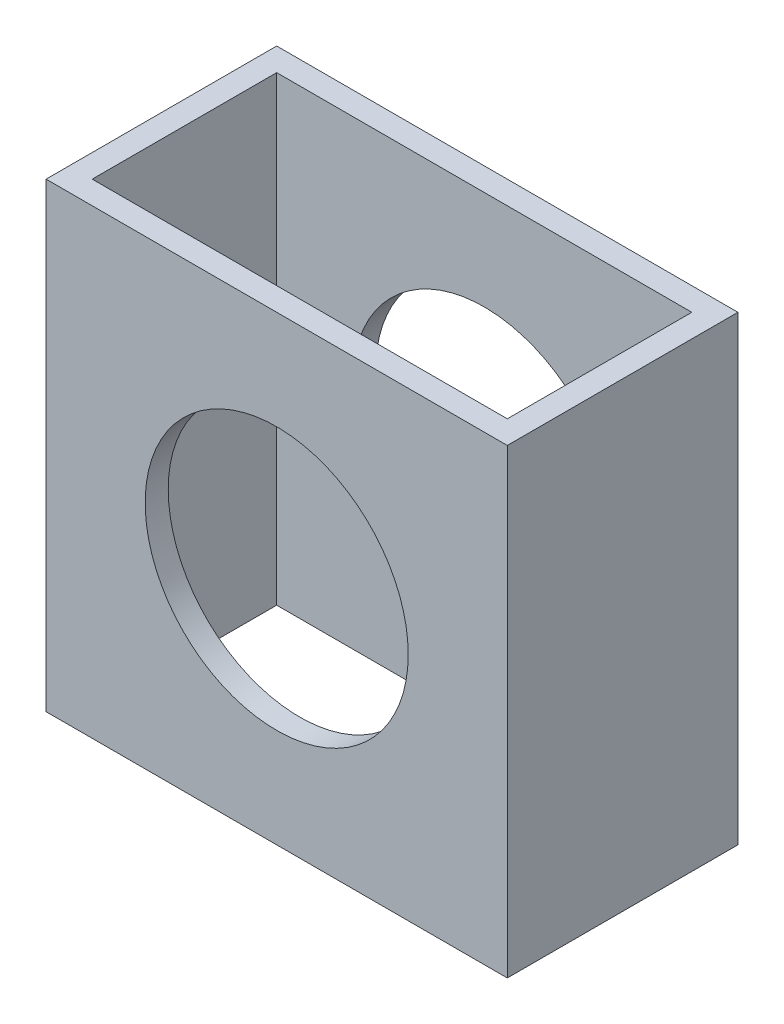
ISO-10303-21;
HEADER;
FILE_DESCRIPTION(('STEP AP214'),'2;1');
FILE_NAME('part.step','',(''),(''),'','','');
FILE_SCHEMA(('AUTOMOTIVE_DESIGN { 1 0 10303 214 1 1 1 1 }'));
ENDSEC;
DATA;
#1=APPLICATION_CONTEXT('core data for automotive mechanical design processes');
#2=APPLICATION_PROTOCOL_DEFINITION('international standard','automotive_design',2000,#1);
#3=PRODUCT_CONTEXT('',#1,'mechanical');
#4=PRODUCT('Part','Part','',(#3));
#5=PRODUCT_RELATED_PRODUCT_CATEGORY('part','',(#4));
#6=PRODUCT_DEFINITION_FORMATION('','',#4);
#7=PRODUCT_DEFINITION_CONTEXT('part definition',#1,'design');
#8=PRODUCT_DEFINITION('design','',#6,#7);
#9=PRODUCT_DEFINITION_SHAPE('','',#8);
#10=(LENGTH_UNIT() NAMED_UNIT(*) SI_UNIT(.MILLI.,.METRE.));
#11=(NAMED_UNIT(*) PLANE_ANGLE_UNIT() SI_UNIT($,.RADIAN.));
#12=(NAMED_UNIT(*) SI_UNIT($,.STERADIAN.) SOLID_ANGLE_UNIT());
#13=UNCERTAINTY_MEASURE_WITH_UNIT(LENGTH_MEASURE(1.E-05),#10,'distance_accuracy_value','');
#14=(GEOMETRIC_REPRESENTATION_CONTEXT(3) GLOBAL_UNCERTAINTY_ASSIGNED_CONTEXT((#13)) GLOBAL_UNIT_ASSIGNED_CONTEXT((#10,
#11,#12)) REPRESENTATION_CONTEXT('',''));
#15=CARTESIAN_POINT('',(0.,0.,0.));
#16=DIRECTION('',(0.,0.,1.));
#17=DIRECTION('',(1.,0.,0.));
#18=AXIS2_PLACEMENT_3D('',#15,#16,#17);
#19=CARTESIAN_POINT('',(-22.86,50.8,-10.16));
#20=DIRECTION('',(0.,0.,1.));
#21=DIRECTION('',(1.,0.,0.));
#22=AXIS2_PLACEMENT_3D('',#19,#20,#21);
#23=PLANE('',#22);
#24=CARTESIAN_POINT('',(0.,25.4,-10.16));
#25=DIRECTION('',(0.,0.,1.));
#26=DIRECTION('',(1.,0.,0.));
#27=AXIS2_PLACEMENT_3D('',#24,#25,#26);
#28=CIRCLE('',#27,14.48562);
#29=CARTESIAN_POINT('',(14.48562,25.4,-10.16));
#30=VERTEX_POINT('',#29);
#31=EDGE_CURVE('E150',#30,#30,#28,.T.);
#32=ORIENTED_EDGE('',*,*,#31,.F.);
#33=EDGE_LOOP('',(#32));
#34=FACE_BOUND('',#33,.T.);
#35=DIRECTION('',(-1.,0.,0.));
#36=VECTOR('',#35,1.);
#37=CARTESIAN_POINT('',(-22.86,0.,-10.16));
#38=LINE('',#37,#36);
#39=CARTESIAN_POINT('',(22.86,0.,-10.16));
#40=VERTEX_POINT('',#39);
#41=CARTESIAN_POINT('',(-22.86,0.,-10.16));
#42=VERTEX_POINT('',#41);
#43=EDGE_CURVE('E156',#40,#42,#38,.T.);
#44=ORIENTED_EDGE('',*,*,#43,.F.);
#45=DIRECTION('',(0.,-1.,0.));
#46=VECTOR('',#45,1.);
#47=CARTESIAN_POINT('',(22.86,50.8,-10.16));
#48=LINE('',#47,#46);
#49=CARTESIAN_POINT('',(22.86,50.8,-10.16));
#50=VERTEX_POINT('',#49);
#51=EDGE_CURVE('E12',#50,#40,#48,.T.);
#52=ORIENTED_EDGE('',*,*,#51,.F.);
#53=DIRECTION('',(-1.,0.,0.));
#54=VECTOR('',#53,1.);
#55=CARTESIAN_POINT('',(-22.86,50.8,-10.16));
#56=LINE('',#55,#54);
#57=CARTESIAN_POINT('',(-22.86,50.8,-10.16));
#58=VERTEX_POINT('',#57);
#59=EDGE_CURVE('E137',#50,#58,#56,.T.);
#60=ORIENTED_EDGE('',*,*,#59,.T.);
#61=DIRECTION('',(0.,-1.,0.));
#62=VECTOR('',#61,1.);
#63=CARTESIAN_POINT('',(-22.86,50.8,-10.16));
#64=LINE('',#63,#62);
#65=EDGE_CURVE('E68',#58,#42,#64,.T.);
#66=ORIENTED_EDGE('',*,*,#65,.T.);
#67=EDGE_LOOP('',(#44,#52,#60,#66));
#68=FACE_BOUND('',#67,.T.);
#69=ADVANCED_FACE('F49',(#34,#68),#23,.T.);
#70=CARTESIAN_POINT('',(22.86,50.8,-10.16));
#71=DIRECTION('',(-1.,0.,0.));
#72=DIRECTION('',(0.,0.,1.));
#73=AXIS2_PLACEMENT_3D('',#70,#71,#72);
#74=PLANE('',#73);
#75=DIRECTION('',(0.,0.,-1.));
#76=VECTOR('',#75,1.);
#77=CARTESIAN_POINT('',(22.86,0.,-10.16));
#78=LINE('',#77,#76);
#79=CARTESIAN_POINT('',(22.86,0.,10.16));
#80=VERTEX_POINT('',#79);
#81=EDGE_CURVE('E126',#80,#40,#78,.T.);
#82=ORIENTED_EDGE('',*,*,#81,.F.);
#83=DIRECTION('',(0.,-1.,0.));
#84=VECTOR('',#83,1.);
#85=CARTESIAN_POINT('',(22.86,50.8,10.16));
#86=LINE('',#85,#84);
#87=CARTESIAN_POINT('',(22.86,50.8,10.16));
#88=VERTEX_POINT('',#87);
#89=EDGE_CURVE('E59',#88,#80,#86,.T.);
#90=ORIENTED_EDGE('',*,*,#89,.F.);
#91=DIRECTION('',(0.,0.,-1.));
#92=VECTOR('',#91,1.);
#93=CARTESIAN_POINT('',(22.86,50.8,-10.16));
#94=LINE('',#93,#92);
#95=EDGE_CURVE('E124',#88,#50,#94,.T.);
#96=ORIENTED_EDGE('',*,*,#95,.T.);
#97=ORIENTED_EDGE('',*,*,#51,.T.);
#98=EDGE_LOOP('',(#82,#90,#96,#97));
#99=FACE_BOUND('',#98,.T.);
#100=ADVANCED_FACE('F123',(#99),#74,.T.);
#101=CARTESIAN_POINT('',(22.86,50.8,10.16));
#102=DIRECTION('',(0.,0.,-1.));
#103=DIRECTION('',(-1.,0.,0.));
#104=AXIS2_PLACEMENT_3D('',#101,#102,#103);
#105=PLANE('',#104);
#106=CARTESIAN_POINT('',(0.,25.4,10.16));
#107=DIRECTION('',(0.,0.,-1.));
#108=DIRECTION('',(-1.,0.,0.));
#109=AXIS2_PLACEMENT_3D('',#106,#107,#108);
#110=CIRCLE('',#109,14.48562);
#111=CARTESIAN_POINT('',(-14.48562,25.4,10.16));
#112=VERTEX_POINT('',#111);
#113=EDGE_CURVE('E201',#112,#112,#110,.T.);
#114=ORIENTED_EDGE('',*,*,#113,.F.);
#115=EDGE_LOOP('',(#114));
#116=FACE_BOUND('',#115,.T.);
#117=DIRECTION('',(1.,0.,0.));
#118=VECTOR('',#117,1.);
#119=CARTESIAN_POINT('',(22.86,0.,10.16));
#120=LINE('',#119,#118);
#121=CARTESIAN_POINT('',(-22.86,0.,10.16));
#122=VERTEX_POINT('',#121);
#123=EDGE_CURVE('E159',#122,#80,#120,.T.);
#124=ORIENTED_EDGE('',*,*,#123,.F.);
#125=DIRECTION('',(0.,-1.,0.));
#126=VECTOR('',#125,1.);
#127=CARTESIAN_POINT('',(-22.86,50.8,10.16));
#128=LINE('',#127,#126);
#129=CARTESIAN_POINT('',(-22.86,50.8,10.16));
#130=VERTEX_POINT('',#129);
#131=EDGE_CURVE('E93',#130,#122,#128,.T.);
#132=ORIENTED_EDGE('',*,*,#131,.F.);
#133=DIRECTION('',(1.,0.,0.));
#134=VECTOR('',#133,1.);
#135=CARTESIAN_POINT('',(22.86,50.8,10.16));
#136=LINE('',#135,#134);
#137=EDGE_CURVE('E136',#130,#88,#136,.T.);
#138=ORIENTED_EDGE('',*,*,#137,.T.);
#139=ORIENTED_EDGE('',*,*,#89,.T.);
#140=EDGE_LOOP('',(#124,#132,#138,#139));
#141=FACE_BOUND('',#140,.T.);
#142=ADVANCED_FACE('F139',(#116,#141),#105,.T.);
#143=CARTESIAN_POINT('',(-25.4,50.8,-12.7));
#144=DIRECTION('',(1.,0.,0.));
#145=DIRECTION('',(0.,0.,-1.));
#146=AXIS2_PLACEMENT_3D('',#143,#144,#145);
#147=PLANE('',#146);
#148=DIRECTION('',(0.,0.,1.));
#149=VECTOR('',#148,1.);
#150=CARTESIAN_POINT('',(-25.4,0.,-12.7));
#151=LINE('',#150,#149);
#152=CARTESIAN_POINT('',(-25.4,0.,-12.7));
#153=VERTEX_POINT('',#152);
#154=CARTESIAN_POINT('',(-25.4,0.,12.7));
#155=VERTEX_POINT('',#154);
#156=EDGE_CURVE('E146',#153,#155,#151,.T.);
#157=ORIENTED_EDGE('',*,*,#156,.T.);
#158=DIRECTION('',(0.,-1.,0.));
#159=VECTOR('',#158,1.);
#160=CARTESIAN_POINT('',(-25.4,50.8,12.7));
#161=LINE('',#160,#159);
#162=CARTESIAN_POINT('',(-25.4,50.8,12.7));
#163=VERTEX_POINT('',#162);
#164=EDGE_CURVE('E53',#163,#155,#161,.T.);
#165=ORIENTED_EDGE('',*,*,#164,.F.);
#166=DIRECTION('',(0.,0.,1.));
#167=VECTOR('',#166,1.);
#168=CARTESIAN_POINT('',(-25.4,50.8,-12.7));
#169=LINE('',#168,#167);
#170=CARTESIAN_POINT('',(-25.4,50.8,-12.7));
#171=VERTEX_POINT('',#170);
#172=EDGE_CURVE('E164',#171,#163,#169,.T.);
#173=ORIENTED_EDGE('',*,*,#172,.F.);
#174=DIRECTION('',(0.,-1.,0.));
#175=VECTOR('',#174,1.);
#176=CARTESIAN_POINT('',(-25.4,50.8,-12.7));
#177=LINE('',#176,#175);
#178=EDGE_CURVE('E142',#171,#153,#177,.T.);
#179=ORIENTED_EDGE('',*,*,#178,.T.);
#180=EDGE_LOOP('',(#157,#165,#173,#179));
#181=FACE_BOUND('',#180,.T.);
#182=ADVANCED_FACE('F51',(#181),#147,.F.);
#183=CARTESIAN_POINT('',(25.4,50.8,12.7));
#184=DIRECTION('',(0.,0.,-1.));
#185=DIRECTION('',(-1.,0.,0.));
#186=AXIS2_PLACEMENT_3D('',#183,#184,#185);
#187=PLANE('',#186);
#188=CARTESIAN_POINT('',(0.,25.4,12.7));
#189=DIRECTION('',(0.,0.,1.));
#190=DIRECTION('',(1.,0.,0.));
#191=AXIS2_PLACEMENT_3D('',#188,#189,#190);
#192=CIRCLE('',#191,14.48562);
#193=CARTESIAN_POINT('',(14.48562,25.4,12.7));
#194=VERTEX_POINT('',#193);
#195=EDGE_CURVE('E207',#194,#194,#192,.T.);
#196=ORIENTED_EDGE('',*,*,#195,.F.);
#197=EDGE_LOOP('',(#196));
#198=FACE_BOUND('',#197,.T.);
#199=DIRECTION('',(1.,0.,0.));
#200=VECTOR('',#199,1.);
#201=CARTESIAN_POINT('',(25.4,0.,12.7));
#202=LINE('',#201,#200);
#203=CARTESIAN_POINT('',(25.4,0.,12.7));
#204=VERTEX_POINT('',#203);
#205=EDGE_CURVE('E149',#155,#204,#202,.T.);
#206=ORIENTED_EDGE('',*,*,#205,.T.);
#207=DIRECTION('',(0.,-1.,0.));
#208=VECTOR('',#207,1.);
#209=CARTESIAN_POINT('',(25.4,50.8,12.7));
#210=LINE('',#209,#208);
#211=CARTESIAN_POINT('',(25.4,50.8,12.7));
#212=VERTEX_POINT('',#211);
#213=EDGE_CURVE('E171',#212,#204,#210,.T.);
#214=ORIENTED_EDGE('',*,*,#213,.F.);
#215=DIRECTION('',(1.,0.,0.));
#216=VECTOR('',#215,1.);
#217=CARTESIAN_POINT('',(25.4,50.8,12.7));
#218=LINE('',#217,#216);
#219=EDGE_CURVE('E106',#163,#212,#218,.T.);
#220=ORIENTED_EDGE('',*,*,#219,.F.);
#221=ORIENTED_EDGE('',*,*,#164,.T.);
#222=EDGE_LOOP('',(#206,#214,#220,#221));
#223=FACE_BOUND('',#222,.T.);
#224=ADVANCED_FACE('F177',(#198,#223),#187,.F.);
#225=CARTESIAN_POINT('',(25.4,50.8,-12.7));
#226=DIRECTION('',(-1.,0.,0.));
#227=DIRECTION('',(0.,0.,1.));
#228=AXIS2_PLACEMENT_3D('',#225,#226,#227);
#229=PLANE('',#228);
#230=DIRECTION('',(0.,0.,-1.));
#231=VECTOR('',#230,1.);
#232=CARTESIAN_POINT('',(25.4,0.,-12.7));
#233=LINE('',#232,#231);
#234=CARTESIAN_POINT('',(25.4,0.,-12.7));
#235=VERTEX_POINT('',#234);
#236=EDGE_CURVE('E152',#204,#235,#233,.T.);
#237=ORIENTED_EDGE('',*,*,#236,.T.);
#238=DIRECTION('',(0.,-1.,0.));
#239=VECTOR('',#238,1.);
#240=CARTESIAN_POINT('',(25.4,50.8,-12.7));
#241=LINE('',#240,#239);
#242=CARTESIAN_POINT('',(25.4,50.8,-12.7));
#243=VERTEX_POINT('',#242);
#244=EDGE_CURVE('E169',#243,#235,#241,.T.);
#245=ORIENTED_EDGE('',*,*,#244,.F.);
#246=DIRECTION('',(0.,0.,-1.));
#247=VECTOR('',#246,1.);
#248=CARTESIAN_POINT('',(25.4,50.8,-12.7));
#249=LINE('',#248,#247);
#250=EDGE_CURVE('E193',#212,#243,#249,.T.);
#251=ORIENTED_EDGE('',*,*,#250,.F.);
#252=ORIENTED_EDGE('',*,*,#213,.T.);
#253=EDGE_LOOP('',(#237,#245,#251,#252));
#254=FACE_BOUND('',#253,.T.);
#255=ADVANCED_FACE('F187',(#254),#229,.F.);
#256=CARTESIAN_POINT('',(-25.4,50.8,-12.7));
#257=DIRECTION('',(0.,0.,1.));
#258=DIRECTION('',(1.,0.,0.));
#259=AXIS2_PLACEMENT_3D('',#256,#257,#258);
#260=PLANE('',#259);
#261=CARTESIAN_POINT('',(0.,25.4,-12.7));
#262=DIRECTION('',(0.,0.,1.));
#263=DIRECTION('',(1.,0.,0.));
#264=AXIS2_PLACEMENT_3D('',#261,#262,#263);
#265=CIRCLE('',#264,14.48562);
#266=CARTESIAN_POINT('',(14.48562,25.4,-12.7));
#267=VERTEX_POINT('',#266);
#268=EDGE_CURVE('E204',#267,#267,#265,.T.);
#269=ORIENTED_EDGE('',*,*,#268,.T.);
#270=EDGE_LOOP('',(#269));
#271=FACE_BOUND('',#270,.T.);
#272=DIRECTION('',(-1.,0.,0.));
#273=VECTOR('',#272,1.);
#274=CARTESIAN_POINT('',(-25.4,0.,-12.7));
#275=LINE('',#274,#273);
#276=EDGE_CURVE('E154',#235,#153,#275,.T.);
#277=ORIENTED_EDGE('',*,*,#276,.T.);
#278=ORIENTED_EDGE('',*,*,#178,.F.);
#279=DIRECTION('',(-1.,0.,0.));
#280=VECTOR('',#279,1.);
#281=CARTESIAN_POINT('',(-25.4,50.8,-12.7));
#282=LINE('',#281,#280);
#283=EDGE_CURVE('E191',#243,#171,#282,.T.);
#284=ORIENTED_EDGE('',*,*,#283,.F.);
#285=ORIENTED_EDGE('',*,*,#244,.T.);
#286=EDGE_LOOP('',(#277,#278,#284,#285));
#287=FACE_BOUND('',#286,.T.);
#288=ADVANCED_FACE('F190',(#271,#287),#260,.F.);
#289=CARTESIAN_POINT('',(-22.86,50.8,-10.16));
#290=DIRECTION('',(1.,0.,0.));
#291=DIRECTION('',(0.,0.,-1.));
#292=AXIS2_PLACEMENT_3D('',#289,#290,#291);
#293=PLANE('',#292);
#294=DIRECTION('',(0.,0.,1.));
#295=VECTOR('',#294,1.);
#296=CARTESIAN_POINT('',(-22.86,0.,-10.16));
#297=LINE('',#296,#295);
#298=EDGE_CURVE('E161',#42,#122,#297,.T.);
#299=ORIENTED_EDGE('',*,*,#298,.F.);
#300=ORIENTED_EDGE('',*,*,#65,.F.);
#301=DIRECTION('',(0.,0.,1.));
#302=VECTOR('',#301,1.);
#303=CARTESIAN_POINT('',(-22.86,50.8,-10.16));
#304=LINE('',#303,#302);
#305=EDGE_CURVE('E140',#58,#130,#304,.T.);
#306=ORIENTED_EDGE('',*,*,#305,.T.);
#307=ORIENTED_EDGE('',*,*,#131,.T.);
#308=EDGE_LOOP('',(#299,#300,#306,#307));
#309=FACE_BOUND('',#308,.T.);
#310=ADVANCED_FACE('F232',(#309),#293,.T.);
#311=CARTESIAN_POINT('',(-25.4,50.8,-12.7));
#312=DIRECTION('',(0.,-1.,0.));
#313=DIRECTION('',(0.,0.,-1.));
#314=AXIS2_PLACEMENT_3D('',#311,#312,#313);
#315=PLANE('',#314);
#316=ORIENTED_EDGE('',*,*,#172,.T.);
#317=ORIENTED_EDGE('',*,*,#219,.T.);
#318=ORIENTED_EDGE('',*,*,#250,.T.);
#319=ORIENTED_EDGE('',*,*,#283,.T.);
#320=EDGE_LOOP('',(#316,#317,#318,#319));
#321=FACE_BOUND('',#320,.T.);
#322=ORIENTED_EDGE('',*,*,#59,.F.);
#323=ORIENTED_EDGE('',*,*,#95,.F.);
#324=ORIENTED_EDGE('',*,*,#137,.F.);
#325=ORIENTED_EDGE('',*,*,#305,.F.);
#326=EDGE_LOOP('',(#322,#323,#324,#325));
#327=FACE_BOUND('',#326,.T.);
#328=ADVANCED_FACE('F134',(#321,#327),#315,.F.);
#329=CARTESIAN_POINT('',(-25.4,0.,-12.7));
#330=DIRECTION('',(0.,-1.,0.));
#331=DIRECTION('',(0.,0.,-1.));
#332=AXIS2_PLACEMENT_3D('',#329,#330,#331);
#333=PLANE('',#332);
#334=ORIENTED_EDGE('',*,*,#156,.F.);
#335=ORIENTED_EDGE('',*,*,#276,.F.);
#336=ORIENTED_EDGE('',*,*,#236,.F.);
#337=ORIENTED_EDGE('',*,*,#205,.F.);
#338=EDGE_LOOP('',(#334,#335,#336,#337));
#339=FACE_BOUND('',#338,.T.);
#340=ORIENTED_EDGE('',*,*,#43,.T.);
#341=ORIENTED_EDGE('',*,*,#298,.T.);
#342=ORIENTED_EDGE('',*,*,#123,.T.);
#343=ORIENTED_EDGE('',*,*,#81,.T.);
#344=EDGE_LOOP('',(#340,#341,#342,#343));
#345=FACE_BOUND('',#344,.T.);
#346=ADVANCED_FACE('F184',(#339,#345),#333,.T.);
#347=CARTESIAN_POINT('',(0.,25.4,12.7));
#348=DIRECTION('',(0.,0.,1.));
#349=DIRECTION('',(1.,0.,0.));
#350=AXIS2_PLACEMENT_3D('',#347,#348,#349);
#351=CYLINDRICAL_SURFACE('',#350,14.48562);
#352=ORIENTED_EDGE('',*,*,#31,.T.);
#353=EDGE_LOOP('',(#352));
#354=FACE_BOUND('',#353,.T.);
#355=ORIENTED_EDGE('',*,*,#268,.F.);
#356=EDGE_LOOP('',(#355));
#357=FACE_BOUND('',#356,.T.);
#358=ADVANCED_FACE('F241',(#354,#357),#351,.F.);
#359=ORIENTED_EDGE('',*,*,#113,.T.);
#360=EDGE_LOOP('',(#359));
#361=FACE_BOUND('',#360,.T.);
#362=ORIENTED_EDGE('',*,*,#195,.T.);
#363=EDGE_LOOP('',(#362));
#364=FACE_BOUND('',#363,.T.);
#365=ADVANCED_FACE('F211',(#361,#364),#351,.F.);
#366=CLOSED_SHELL('',(#69,#100,#142,#182,#224,#255,#288,#310,#328,#346,#358,#365));
#367=MANIFOLD_SOLID_BREP('B2',#366);
#368=ADVANCED_BREP_SHAPE_REPRESENTATION('',(#18,#367),#14);
#369=SHAPE_DEFINITION_REPRESENTATION(#9,#368);
ENDSEC;
END-ISO-10303-21;
